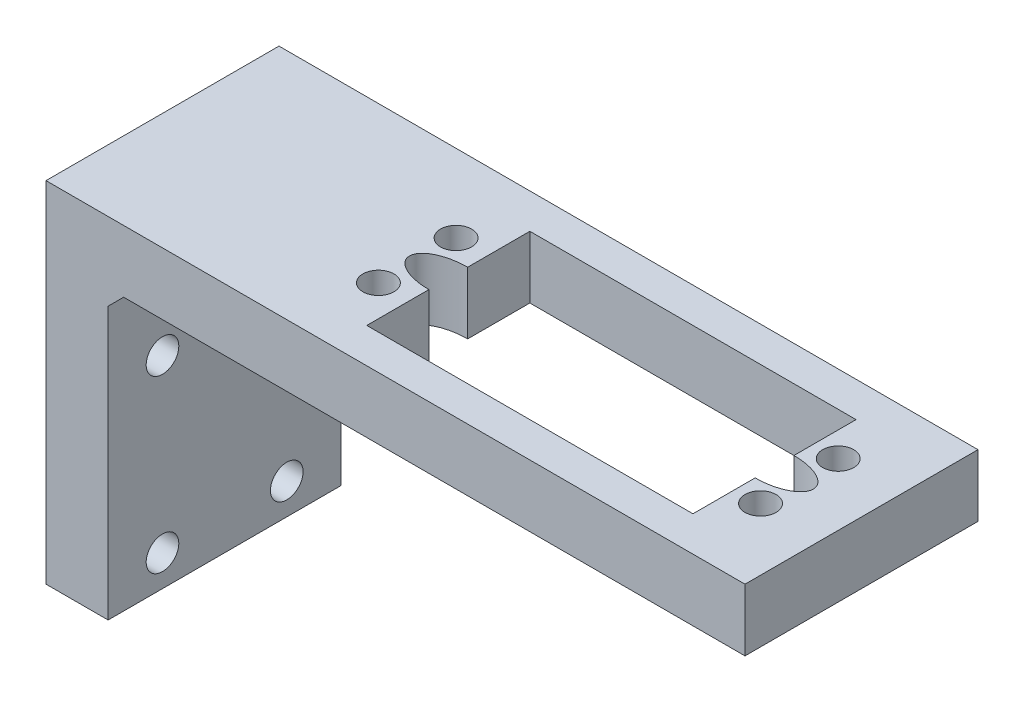
ISO-10303-21;
HEADER;
FILE_DESCRIPTION(('STEP AP214'),'2;1');
FILE_NAME('part.step','',(''),(''),'','','');
FILE_SCHEMA(('AUTOMOTIVE_DESIGN { 1 0 10303 214 1 1 1 1 }'));
ENDSEC;
DATA;
#1=APPLICATION_CONTEXT('core data for automotive mechanical design processes');
#2=APPLICATION_PROTOCOL_DEFINITION('international standard','automotive_design',2000,#1);
#3=PRODUCT_CONTEXT('',#1,'mechanical');
#4=PRODUCT('Part','Part','',(#3));
#5=PRODUCT_RELATED_PRODUCT_CATEGORY('part','',(#4));
#6=PRODUCT_DEFINITION_FORMATION('','',#4);
#7=PRODUCT_DEFINITION_CONTEXT('part definition',#1,'design');
#8=PRODUCT_DEFINITION('design','',#6,#7);
#9=PRODUCT_DEFINITION_SHAPE('','',#8);
#10=(LENGTH_UNIT() NAMED_UNIT(*) SI_UNIT(.MILLI.,.METRE.));
#11=(NAMED_UNIT(*) PLANE_ANGLE_UNIT() SI_UNIT($,.RADIAN.));
#12=(NAMED_UNIT(*) SI_UNIT($,.STERADIAN.) SOLID_ANGLE_UNIT());
#13=UNCERTAINTY_MEASURE_WITH_UNIT(LENGTH_MEASURE(1.E-05),#10,'distance_accuracy_value','');
#14=(GEOMETRIC_REPRESENTATION_CONTEXT(3) GLOBAL_UNCERTAINTY_ASSIGNED_CONTEXT((#13)) GLOBAL_UNIT_ASSIGNED_CONTEXT((#10,
#11,#12)) REPRESENTATION_CONTEXT('',''));
#15=CARTESIAN_POINT('',(0.,0.,0.));
#16=DIRECTION('',(0.,0.,1.));
#17=DIRECTION('',(1.,0.,0.));
#18=AXIS2_PLACEMENT_3D('',#15,#16,#17);
#19=CARTESIAN_POINT('',(0.,8.,0.));
#20=DIRECTION('',(0.,0.,-1.));
#21=DIRECTION('',(-1.,0.,0.));
#22=AXIS2_PLACEMENT_3D('',#19,#20,#21);
#23=PLANE('',#22);
#24=DIRECTION('',(0.707106781186548,0.707106781186548,0.));
#25=VECTOR('',#24,1.);
#26=CARTESIAN_POINT('',(0.,-2.,0.));
#27=LINE('',#26,#25);
#28=CARTESIAN_POINT('',(0.,-2.,0.));
#29=VERTEX_POINT('',#28);
#30=CARTESIAN_POINT('',(2.,0.,0.));
#31=VERTEX_POINT('',#30);
#32=EDGE_CURVE('E151',#29,#31,#27,.T.);
#33=ORIENTED_EDGE('',*,*,#32,.T.);
#34=DIRECTION('',(1.,0.,0.));
#35=VECTOR('',#34,1.);
#36=CARTESIAN_POINT('',(0.,0.,0.));
#37=LINE('',#36,#35);
#38=CARTESIAN_POINT('',(82.,0.,0.));
#39=VERTEX_POINT('',#38);
#40=EDGE_CURVE('E253',#31,#39,#37,.T.);
#41=ORIENTED_EDGE('',*,*,#40,.T.);
#42=DIRECTION('',(0.,-1.,0.));
#43=VECTOR('',#42,1.);
#44=CARTESIAN_POINT('',(82.,8.,0.));
#45=LINE('',#44,#43);
#46=CARTESIAN_POINT('',(82.,8.,0.));
#47=VERTEX_POINT('',#46);
#48=EDGE_CURVE('E11',#47,#39,#45,.T.);
#49=ORIENTED_EDGE('',*,*,#48,.F.);
#50=DIRECTION('',(1.,0.,0.));
#51=VECTOR('',#50,1.);
#52=CARTESIAN_POINT('',(0.,8.,0.));
#53=LINE('',#52,#51);
#54=CARTESIAN_POINT('',(-8.00000000000001,8.,0.));
#55=VERTEX_POINT('',#54);
#56=EDGE_CURVE('E258',#55,#47,#53,.T.);
#57=ORIENTED_EDGE('',*,*,#56,.F.);
#58=DIRECTION('',(0.,1.,0.));
#59=VECTOR('',#58,1.);
#60=CARTESIAN_POINT('',(-8.00000000000001,-37.,0.));
#61=LINE('',#60,#59);
#62=CARTESIAN_POINT('',(-8.00000000000001,-37.,0.));
#63=VERTEX_POINT('',#62);
#64=EDGE_CURVE('E177',#63,#55,#61,.T.);
#65=ORIENTED_EDGE('',*,*,#64,.F.);
#66=DIRECTION('',(1.,0.,0.));
#67=VECTOR('',#66,1.);
#68=CARTESIAN_POINT('',(0.,-37.,0.));
#69=LINE('',#68,#67);
#70=CARTESIAN_POINT('',(0.,-37.,0.));
#71=VERTEX_POINT('',#70);
#72=EDGE_CURVE('E286',#63,#71,#69,.T.);
#73=ORIENTED_EDGE('',*,*,#72,.T.);
#74=DIRECTION('',(0.,1.,0.));
#75=VECTOR('',#74,1.);
#76=CARTESIAN_POINT('',(0.,-37.,0.));
#77=LINE('',#76,#75);
#78=EDGE_CURVE('E172',#71,#29,#77,.T.);
#79=ORIENTED_EDGE('',*,*,#78,.T.);
#80=EDGE_LOOP('',(#33,#41,#49,#57,#65,#73,#79));
#81=FACE_BOUND('',#80,.T.);
#82=ADVANCED_FACE('F38',(#81),#23,.F.);
#83=CARTESIAN_POINT('',(82.,8.,0.));
#84=DIRECTION('',(-1.,0.,0.));
#85=DIRECTION('',(0.,0.,1.));
#86=AXIS2_PLACEMENT_3D('',#83,#84,#85);
#87=PLANE('',#86);
#88=DIRECTION('',(0.,0.,-1.));
#89=VECTOR('',#88,1.);
#90=CARTESIAN_POINT('',(82.,0.,0.));
#91=LINE('',#90,#89);
#92=CARTESIAN_POINT('',(82.,0.,-30.));
#93=VERTEX_POINT('',#92);
#94=EDGE_CURVE('E248',#39,#93,#91,.T.);
#95=ORIENTED_EDGE('',*,*,#94,.T.);
#96=DIRECTION('',(0.,-1.,0.));
#97=VECTOR('',#96,1.);
#98=CARTESIAN_POINT('',(82.,8.,-30.));
#99=LINE('',#98,#97);
#100=CARTESIAN_POINT('',(82.,8.,-30.));
#101=VERTEX_POINT('',#100);
#102=EDGE_CURVE('E46',#101,#93,#99,.T.);
#103=ORIENTED_EDGE('',*,*,#102,.F.);
#104=DIRECTION('',(0.,0.,-1.));
#105=VECTOR('',#104,1.);
#106=CARTESIAN_POINT('',(82.,8.,0.));
#107=LINE('',#106,#105);
#108=EDGE_CURVE('E260',#47,#101,#107,.T.);
#109=ORIENTED_EDGE('',*,*,#108,.F.);
#110=ORIENTED_EDGE('',*,*,#48,.T.);
#111=EDGE_LOOP('',(#95,#103,#109,#110));
#112=FACE_BOUND('',#111,.T.);
#113=ADVANCED_FACE('F239',(#112),#87,.F.);
#114=CARTESIAN_POINT('',(0.,8.,-30.));
#115=DIRECTION('',(0.,0.,1.));
#116=DIRECTION('',(1.,0.,0.));
#117=AXIS2_PLACEMENT_3D('',#114,#115,#116);
#118=PLANE('',#117);
#119=DIRECTION('',(-1.,0.,0.));
#120=VECTOR('',#119,1.);
#121=CARTESIAN_POINT('',(0.,0.,-30.));
#122=LINE('',#121,#120);
#123=CARTESIAN_POINT('',(2.,0.,-30.));
#124=VERTEX_POINT('',#123);
#125=EDGE_CURVE('E165',#93,#124,#122,.T.);
#126=ORIENTED_EDGE('',*,*,#125,.T.);
#127=DIRECTION('',(0.707106781186548,0.707106781186548,0.));
#128=VECTOR('',#127,1.);
#129=CARTESIAN_POINT('',(0.,-2.,-30.));
#130=LINE('',#129,#128);
#131=CARTESIAN_POINT('',(0.,-2.,-30.));
#132=VERTEX_POINT('',#131);
#133=EDGE_CURVE('E148',#132,#124,#130,.T.);
#134=ORIENTED_EDGE('',*,*,#133,.F.);
#135=DIRECTION('',(0.,1.,0.));
#136=VECTOR('',#135,1.);
#137=CARTESIAN_POINT('',(0.,-37.,-30.));
#138=LINE('',#137,#136);
#139=CARTESIAN_POINT('',(0.,-37.,-30.));
#140=VERTEX_POINT('',#139);
#141=EDGE_CURVE('E161',#140,#132,#138,.T.);
#142=ORIENTED_EDGE('',*,*,#141,.F.);
#143=DIRECTION('',(-1.,0.,0.));
#144=VECTOR('',#143,1.);
#145=CARTESIAN_POINT('',(-8.00000000000001,-37.,-30.));
#146=LINE('',#145,#144);
#147=CARTESIAN_POINT('',(-8.00000000000001,-37.,-30.));
#148=VERTEX_POINT('',#147);
#149=EDGE_CURVE('E281',#140,#148,#146,.T.);
#150=ORIENTED_EDGE('',*,*,#149,.T.);
#151=DIRECTION('',(0.,1.,0.));
#152=VECTOR('',#151,1.);
#153=CARTESIAN_POINT('',(-8.00000000000001,-37.,-30.));
#154=LINE('',#153,#152);
#155=CARTESIAN_POINT('',(-8.00000000000001,8.,-30.));
#156=VERTEX_POINT('',#155);
#157=EDGE_CURVE('E185',#148,#156,#154,.T.);
#158=ORIENTED_EDGE('',*,*,#157,.T.);
#159=DIRECTION('',(-1.,0.,0.));
#160=VECTOR('',#159,1.);
#161=CARTESIAN_POINT('',(0.,8.,-30.));
#162=LINE('',#161,#160);
#163=EDGE_CURVE('E255',#101,#156,#162,.T.);
#164=ORIENTED_EDGE('',*,*,#163,.F.);
#165=ORIENTED_EDGE('',*,*,#102,.T.);
#166=EDGE_LOOP('',(#126,#134,#142,#150,#158,#164,#165));
#167=FACE_BOUND('',#166,.T.);
#168=ADVANCED_FACE('F159',(#167),#118,.F.);
#169=CARTESIAN_POINT('',(0.,8.,0.));
#170=DIRECTION('',(0.,-1.,0.));
#171=DIRECTION('',(0.,0.,-1.));
#172=AXIS2_PLACEMENT_3D('',#169,#170,#171);
#173=PLANE('',#172);
#174=CARTESIAN_POINT('',(24.8,8.,-10.));
#175=DIRECTION('',(0.,1.,0.));
#176=DIRECTION('',(0.,0.,1.));
#177=AXIS2_PLACEMENT_3D('',#174,#175,#176);
#178=CIRCLE('',#177,2.);
#179=CARTESIAN_POINT('',(24.8,8.,-7.99999999999999));
#180=VERTEX_POINT('',#179);
#181=EDGE_CURVE('E171',#180,#180,#178,.T.);
#182=ORIENTED_EDGE('',*,*,#181,.F.);
#183=EDGE_LOOP('',(#182));
#184=FACE_BOUND('',#183,.T.);
#185=CARTESIAN_POINT('',(24.8,8.,-20.));
#186=DIRECTION('',(0.,1.,0.));
#187=DIRECTION('',(0.,0.,1.));
#188=AXIS2_PLACEMENT_3D('',#185,#186,#187);
#189=CIRCLE('',#188,2.);
#190=CARTESIAN_POINT('',(24.8,8.,-18.));
#191=VERTEX_POINT('',#190);
#192=EDGE_CURVE('E203',#191,#191,#189,.T.);
#193=ORIENTED_EDGE('',*,*,#192,.F.);
#194=EDGE_LOOP('',(#193));
#195=FACE_BOUND('',#194,.T.);
#196=CARTESIAN_POINT('',(74.,8.,-10.));
#197=DIRECTION('',(0.,1.,0.));
#198=DIRECTION('',(0.,0.,1.));
#199=AXIS2_PLACEMENT_3D('',#196,#197,#198);
#200=CIRCLE('',#199,2.);
#201=CARTESIAN_POINT('',(74.,8.,-8.));
#202=VERTEX_POINT('',#201);
#203=EDGE_CURVE('E197',#202,#202,#200,.T.);
#204=ORIENTED_EDGE('',*,*,#203,.F.);
#205=EDGE_LOOP('',(#204));
#206=FACE_BOUND('',#205,.T.);
#207=CARTESIAN_POINT('',(74.,8.,-20.));
#208=DIRECTION('',(0.,1.,0.));
#209=DIRECTION('',(0.,0.,1.));
#210=AXIS2_PLACEMENT_3D('',#207,#208,#209);
#211=CIRCLE('',#210,2.);
#212=CARTESIAN_POINT('',(74.,8.,-18.));
#213=VERTEX_POINT('',#212);
#214=EDGE_CURVE('E191',#213,#213,#211,.T.);
#215=ORIENTED_EDGE('',*,*,#214,.F.);
#216=EDGE_LOOP('',(#215));
#217=FACE_BOUND('',#216,.T.);
#218=CARTESIAN_POINT('',(28.8,8.,-15.));
#219=DIRECTION('',(0.,1.,0.));
#220=DIRECTION('',(1.,0.,0.));
#221=AXIS2_PLACEMENT_3D('',#218,#219,#220);
#222=ELLIPSE('',#221,5.,2.5);
#223=CARTESIAN_POINT('',(28.8,8.,-17.5));
#224=VERTEX_POINT('',#223);
#225=CARTESIAN_POINT('',(28.8,8.,-12.5));
#226=VERTEX_POINT('',#225);
#227=EDGE_CURVE('E334',#224,#226,#222,.T.);
#228=ORIENTED_EDGE('',*,*,#227,.F.);
#229=DIRECTION('',(0.,0.,1.));
#230=VECTOR('',#229,1.);
#231=CARTESIAN_POINT('',(28.8,8.,-25.5));
#232=LINE('',#231,#230);
#233=CARTESIAN_POINT('',(28.8,8.,-25.5));
#234=VERTEX_POINT('',#233);
#235=EDGE_CURVE('E54',#234,#224,#232,.T.);
#236=ORIENTED_EDGE('',*,*,#235,.F.);
#237=DIRECTION('',(-1.,0.,0.));
#238=VECTOR('',#237,1.);
#239=CARTESIAN_POINT('',(28.8,8.,-25.5));
#240=LINE('',#239,#238);
#241=CARTESIAN_POINT('',(70.8,8.,-25.5));
#242=VERTEX_POINT('',#241);
#243=EDGE_CURVE('E212',#242,#234,#240,.T.);
#244=ORIENTED_EDGE('',*,*,#243,.F.);
#245=DIRECTION('',(0.,0.,-1.));
#246=VECTOR('',#245,1.);
#247=CARTESIAN_POINT('',(70.8,8.,-25.5));
#248=LINE('',#247,#246);
#249=CARTESIAN_POINT('',(70.8,8.,-17.5));
#250=VERTEX_POINT('',#249);
#251=EDGE_CURVE('E347',#250,#242,#248,.T.);
#252=ORIENTED_EDGE('',*,*,#251,.F.);
#253=CARTESIAN_POINT('',(70.8,8.,-15.));
#254=DIRECTION('',(0.,1.,0.));
#255=DIRECTION('',(-1.,0.,0.));
#256=AXIS2_PLACEMENT_3D('',#253,#254,#255);
#257=ELLIPSE('',#256,4.99999999999999,2.5);
#258=CARTESIAN_POINT('',(70.8,8.,-12.5));
#259=VERTEX_POINT('',#258);
#260=EDGE_CURVE('E345',#259,#250,#257,.T.);
#261=ORIENTED_EDGE('',*,*,#260,.F.);
#262=DIRECTION('',(0.,0.,-1.));
#263=VECTOR('',#262,1.);
#264=CARTESIAN_POINT('',(70.8,8.,-12.5));
#265=LINE('',#264,#263);
#266=CARTESIAN_POINT('',(70.8,8.,-4.5));
#267=VERTEX_POINT('',#266);
#268=EDGE_CURVE('E342',#267,#259,#265,.T.);
#269=ORIENTED_EDGE('',*,*,#268,.F.);
#270=DIRECTION('',(1.,0.,0.));
#271=VECTOR('',#270,1.);
#272=CARTESIAN_POINT('',(28.8,8.,-4.5));
#273=LINE('',#272,#271);
#274=CARTESIAN_POINT('',(28.8,8.,-4.5));
#275=VERTEX_POINT('',#274);
#276=EDGE_CURVE('E339',#275,#267,#273,.T.);
#277=ORIENTED_EDGE('',*,*,#276,.F.);
#278=DIRECTION('',(0.,0.,1.));
#279=VECTOR('',#278,1.);
#280=CARTESIAN_POINT('',(28.8,8.,-12.5));
#281=LINE('',#280,#279);
#282=EDGE_CURVE('E336',#226,#275,#281,.T.);
#283=ORIENTED_EDGE('',*,*,#282,.F.);
#284=EDGE_LOOP('',(#228,#236,#244,#252,#261,#269,#277,#283));
#285=FACE_BOUND('',#284,.T.);
#286=ORIENTED_EDGE('',*,*,#163,.T.);
#287=DIRECTION('',(0.,0.,1.));
#288=VECTOR('',#287,1.);
#289=CARTESIAN_POINT('',(-8.00000000000001,8.,0.));
#290=LINE('',#289,#288);
#291=EDGE_CURVE('E180',#156,#55,#290,.T.);
#292=ORIENTED_EDGE('',*,*,#291,.T.);
#293=ORIENTED_EDGE('',*,*,#56,.T.);
#294=ORIENTED_EDGE('',*,*,#108,.T.);
#295=EDGE_LOOP('',(#286,#292,#293,#294));
#296=FACE_BOUND('',#295,.T.);
#297=ADVANCED_FACE('F231',(#184,#195,#206,#217,#285,#296),#173,.F.);
#298=CARTESIAN_POINT('',(0.,0.,0.));
#299=DIRECTION('',(0.,-1.,0.));
#300=DIRECTION('',(0.,0.,-1.));
#301=AXIS2_PLACEMENT_3D('',#298,#299,#300);
#302=PLANE('',#301);
#303=DIRECTION('',(0.,0.,1.));
#304=VECTOR('',#303,1.);
#305=CARTESIAN_POINT('',(2.,0.,-30.));
#306=LINE('',#305,#304);
#307=EDGE_CURVE('E155',#124,#31,#306,.T.);
#308=ORIENTED_EDGE('',*,*,#307,.F.);
#309=ORIENTED_EDGE('',*,*,#125,.F.);
#310=ORIENTED_EDGE('',*,*,#94,.F.);
#311=ORIENTED_EDGE('',*,*,#40,.F.);
#312=EDGE_LOOP('',(#308,#309,#310,#311));
#313=FACE_BOUND('',#312,.T.);
#314=CARTESIAN_POINT('',(24.8,0.,-10.));
#315=DIRECTION('',(0.,1.,0.));
#316=DIRECTION('',(0.,0.,1.));
#317=AXIS2_PLACEMENT_3D('',#314,#315,#316);
#318=CIRCLE('',#317,2.);
#319=CARTESIAN_POINT('',(24.8,0.,-7.99999999999999));
#320=VERTEX_POINT('',#319);
#321=EDGE_CURVE('E175',#320,#320,#318,.T.);
#322=ORIENTED_EDGE('',*,*,#321,.T.);
#323=EDGE_LOOP('',(#322));
#324=FACE_BOUND('',#323,.T.);
#325=CARTESIAN_POINT('',(24.8,0.,-20.));
#326=DIRECTION('',(0.,1.,0.));
#327=DIRECTION('',(0.,0.,1.));
#328=AXIS2_PLACEMENT_3D('',#325,#326,#327);
#329=CIRCLE('',#328,2.);
#330=CARTESIAN_POINT('',(24.8,0.,-18.));
#331=VERTEX_POINT('',#330);
#332=EDGE_CURVE('E200',#331,#331,#329,.T.);
#333=ORIENTED_EDGE('',*,*,#332,.T.);
#334=EDGE_LOOP('',(#333));
#335=FACE_BOUND('',#334,.T.);
#336=CARTESIAN_POINT('',(74.,0.,-10.));
#337=DIRECTION('',(0.,1.,0.));
#338=DIRECTION('',(0.,0.,1.));
#339=AXIS2_PLACEMENT_3D('',#336,#337,#338);
#340=CIRCLE('',#339,2.);
#341=CARTESIAN_POINT('',(74.,0.,-8.));
#342=VERTEX_POINT('',#341);
#343=EDGE_CURVE('E194',#342,#342,#340,.T.);
#344=ORIENTED_EDGE('',*,*,#343,.T.);
#345=EDGE_LOOP('',(#344));
#346=FACE_BOUND('',#345,.T.);
#347=CARTESIAN_POINT('',(74.,0.,-20.));
#348=DIRECTION('',(0.,1.,0.));
#349=DIRECTION('',(0.,0.,1.));
#350=AXIS2_PLACEMENT_3D('',#347,#348,#349);
#351=CIRCLE('',#350,2.);
#352=CARTESIAN_POINT('',(74.,0.,-18.));
#353=VERTEX_POINT('',#352);
#354=EDGE_CURVE('E188',#353,#353,#351,.T.);
#355=ORIENTED_EDGE('',*,*,#354,.T.);
#356=EDGE_LOOP('',(#355));
#357=FACE_BOUND('',#356,.T.);
#358=DIRECTION('',(0.,0.,1.));
#359=VECTOR('',#358,1.);
#360=CARTESIAN_POINT('',(28.8,0.,-25.5));
#361=LINE('',#360,#359);
#362=CARTESIAN_POINT('',(28.8,0.,-25.5));
#363=VERTEX_POINT('',#362);
#364=CARTESIAN_POINT('',(28.8,0.,-17.5));
#365=VERTEX_POINT('',#364);
#366=EDGE_CURVE('E208',#363,#365,#361,.T.);
#367=ORIENTED_EDGE('',*,*,#366,.T.);
#368=CARTESIAN_POINT('',(28.8,0.,-15.));
#369=DIRECTION('',(0.,1.,0.));
#370=DIRECTION('',(1.,0.,0.));
#371=AXIS2_PLACEMENT_3D('',#368,#369,#370);
#372=ELLIPSE('',#371,5.,2.5);
#373=CARTESIAN_POINT('',(28.8,0.,-12.5));
#374=VERTEX_POINT('',#373);
#375=EDGE_CURVE('E211',#365,#374,#372,.T.);
#376=ORIENTED_EDGE('',*,*,#375,.T.);
#377=DIRECTION('',(0.,0.,1.));
#378=VECTOR('',#377,1.);
#379=CARTESIAN_POINT('',(28.8,0.,-12.5));
#380=LINE('',#379,#378);
#381=CARTESIAN_POINT('',(28.8,0.,-4.5));
#382=VERTEX_POINT('',#381);
#383=EDGE_CURVE('E62',#374,#382,#380,.T.);
#384=ORIENTED_EDGE('',*,*,#383,.T.);
#385=DIRECTION('',(1.,0.,0.));
#386=VECTOR('',#385,1.);
#387=CARTESIAN_POINT('',(28.8,0.,-4.5));
#388=LINE('',#387,#386);
#389=CARTESIAN_POINT('',(70.8,0.,-4.5));
#390=VERTEX_POINT('',#389);
#391=EDGE_CURVE('E359',#382,#390,#388,.T.);
#392=ORIENTED_EDGE('',*,*,#391,.T.);
#393=DIRECTION('',(0.,0.,-1.));
#394=VECTOR('',#393,1.);
#395=CARTESIAN_POINT('',(70.8,0.,-12.5));
#396=LINE('',#395,#394);
#397=CARTESIAN_POINT('',(70.8,0.,-12.5));
#398=VERTEX_POINT('',#397);
#399=EDGE_CURVE('E360',#390,#398,#396,.T.);
#400=ORIENTED_EDGE('',*,*,#399,.T.);
#401=CARTESIAN_POINT('',(70.8,0.,-15.));
#402=DIRECTION('',(0.,1.,0.));
#403=DIRECTION('',(-1.,0.,0.));
#404=AXIS2_PLACEMENT_3D('',#401,#402,#403);
#405=ELLIPSE('',#404,4.99999999999999,2.5);
#406=CARTESIAN_POINT('',(70.8,0.,-17.5));
#407=VERTEX_POINT('',#406);
#408=EDGE_CURVE('E329',#398,#407,#405,.T.);
#409=ORIENTED_EDGE('',*,*,#408,.T.);
#410=DIRECTION('',(0.,0.,-1.));
#411=VECTOR('',#410,1.);
#412=CARTESIAN_POINT('',(70.8,0.,-25.5));
#413=LINE('',#412,#411);
#414=CARTESIAN_POINT('',(70.8,0.,-25.5));
#415=VERTEX_POINT('',#414);
#416=EDGE_CURVE('E324',#407,#415,#413,.T.);
#417=ORIENTED_EDGE('',*,*,#416,.T.);
#418=DIRECTION('',(-1.,0.,0.));
#419=VECTOR('',#418,1.);
#420=CARTESIAN_POINT('',(28.8,0.,-25.5));
#421=LINE('',#420,#419);
#422=EDGE_CURVE('E319',#415,#363,#421,.T.);
#423=ORIENTED_EDGE('',*,*,#422,.T.);
#424=EDGE_LOOP('',(#367,#376,#384,#392,#400,#409,#417,#423));
#425=FACE_BOUND('',#424,.T.);
#426=ADVANCED_FACE('F230',(#313,#324,#335,#346,#357,#425),#302,.T.);
#427=CARTESIAN_POINT('',(28.8,0.,-25.5));
#428=DIRECTION('',(-1.,0.,0.));
#429=DIRECTION('',(0.,0.,1.));
#430=AXIS2_PLACEMENT_3D('',#427,#428,#429);
#431=PLANE('',#430);
#432=ORIENTED_EDGE('',*,*,#235,.T.);
#433=DIRECTION('',(0.,1.,0.));
#434=VECTOR('',#433,1.);
#435=CARTESIAN_POINT('',(28.8,0.,-17.5));
#436=LINE('',#435,#434);
#437=EDGE_CURVE('E318',#365,#224,#436,.T.);
#438=ORIENTED_EDGE('',*,*,#437,.F.);
#439=ORIENTED_EDGE('',*,*,#366,.F.);
#440=DIRECTION('',(0.,1.,0.));
#441=VECTOR('',#440,1.);
#442=CARTESIAN_POINT('',(28.8,0.,-25.5));
#443=LINE('',#442,#441);
#444=EDGE_CURVE('E299',#363,#234,#443,.T.);
#445=ORIENTED_EDGE('',*,*,#444,.T.);
#446=EDGE_LOOP('',(#432,#438,#439,#445));
#447=FACE_BOUND('',#446,.T.);
#448=ADVANCED_FACE('F226',(#447),#431,.F.);
#449=CARTESIAN_POINT('',(28.8,0.,-25.5));
#450=DIRECTION('',(0.,0.,-1.));
#451=DIRECTION('',(-1.,0.,0.));
#452=AXIS2_PLACEMENT_3D('',#449,#450,#451);
#453=PLANE('',#452);
#454=ORIENTED_EDGE('',*,*,#243,.T.);
#455=ORIENTED_EDGE('',*,*,#444,.F.);
#456=ORIENTED_EDGE('',*,*,#422,.F.);
#457=DIRECTION('',(0.,1.,0.));
#458=VECTOR('',#457,1.);
#459=CARTESIAN_POINT('',(70.8,0.,-25.5));
#460=LINE('',#459,#458);
#461=EDGE_CURVE('E300',#415,#242,#460,.T.);
#462=ORIENTED_EDGE('',*,*,#461,.T.);
#463=EDGE_LOOP('',(#454,#455,#456,#462));
#464=FACE_BOUND('',#463,.T.);
#465=ADVANCED_FACE('F229',(#464),#453,.F.);
#466=CARTESIAN_POINT('',(70.8,0.,-25.5));
#467=DIRECTION('',(1.,0.,0.));
#468=DIRECTION('',(0.,0.,-1.));
#469=AXIS2_PLACEMENT_3D('',#466,#467,#468);
#470=PLANE('',#469);
#471=ORIENTED_EDGE('',*,*,#251,.T.);
#472=ORIENTED_EDGE('',*,*,#461,.F.);
#473=ORIENTED_EDGE('',*,*,#416,.F.);
#474=DIRECTION('',(0.,1.,0.));
#475=VECTOR('',#474,1.);
#476=CARTESIAN_POINT('',(70.8,0.,-17.5));
#477=LINE('',#476,#475);
#478=EDGE_CURVE('E304',#407,#250,#477,.T.);
#479=ORIENTED_EDGE('',*,*,#478,.T.);
#480=EDGE_LOOP('',(#471,#472,#473,#479));
#481=FACE_BOUND('',#480,.T.);
#482=ADVANCED_FACE('F370',(#481),#470,.F.);
#483=DIRECTION('',(0.,1.,0.));
#484=VECTOR('',#483,1.);
#485=SURFACE_OF_LINEAR_EXTRUSION('',#405,#484);
#486=ORIENTED_EDGE('',*,*,#260,.T.);
#487=ORIENTED_EDGE('',*,*,#478,.F.);
#488=ORIENTED_EDGE('',*,*,#408,.F.);
#489=DIRECTION('',(0.,1.,0.));
#490=VECTOR('',#489,1.);
#491=CARTESIAN_POINT('',(70.8,0.,-12.5));
#492=LINE('',#491,#490);
#493=EDGE_CURVE('E310',#398,#259,#492,.T.);
#494=ORIENTED_EDGE('',*,*,#493,.T.);
#495=EDGE_LOOP('',(#486,#487,#488,#494));
#496=FACE_BOUND('',#495,.T.);
#497=ADVANCED_FACE('F365',(#496),#485,.F.);
#498=CARTESIAN_POINT('',(70.8,0.,-12.5));
#499=DIRECTION('',(1.,0.,0.));
#500=DIRECTION('',(0.,0.,-1.));
#501=AXIS2_PLACEMENT_3D('',#498,#499,#500);
#502=PLANE('',#501);
#503=ORIENTED_EDGE('',*,*,#268,.T.);
#504=ORIENTED_EDGE('',*,*,#493,.F.);
#505=ORIENTED_EDGE('',*,*,#399,.F.);
#506=DIRECTION('',(0.,1.,0.));
#507=VECTOR('',#506,1.);
#508=CARTESIAN_POINT('',(70.8,0.,-4.5));
#509=LINE('',#508,#507);
#510=EDGE_CURVE('E312',#390,#267,#509,.T.);
#511=ORIENTED_EDGE('',*,*,#510,.T.);
#512=EDGE_LOOP('',(#503,#504,#505,#511));
#513=FACE_BOUND('',#512,.T.);
#514=ADVANCED_FACE('F369',(#513),#502,.F.);
#515=CARTESIAN_POINT('',(28.8,0.,-4.5));
#516=DIRECTION('',(0.,0.,1.));
#517=DIRECTION('',(1.,0.,0.));
#518=AXIS2_PLACEMENT_3D('',#515,#516,#517);
#519=PLANE('',#518);
#520=ORIENTED_EDGE('',*,*,#276,.T.);
#521=ORIENTED_EDGE('',*,*,#510,.F.);
#522=ORIENTED_EDGE('',*,*,#391,.F.);
#523=DIRECTION('',(0.,1.,0.));
#524=VECTOR('',#523,1.);
#525=CARTESIAN_POINT('',(28.8,0.,-4.5));
#526=LINE('',#525,#524);
#527=EDGE_CURVE('E314',#382,#275,#526,.T.);
#528=ORIENTED_EDGE('',*,*,#527,.T.);
#529=EDGE_LOOP('',(#520,#521,#522,#528));
#530=FACE_BOUND('',#529,.T.);
#531=ADVANCED_FACE('F374',(#530),#519,.F.);
#532=CARTESIAN_POINT('',(28.8,0.,-12.5));
#533=DIRECTION('',(-1.,0.,0.));
#534=DIRECTION('',(0.,0.,1.));
#535=AXIS2_PLACEMENT_3D('',#532,#533,#534);
#536=PLANE('',#535);
#537=ORIENTED_EDGE('',*,*,#282,.T.);
#538=ORIENTED_EDGE('',*,*,#527,.F.);
#539=ORIENTED_EDGE('',*,*,#383,.F.);
#540=DIRECTION('',(0.,1.,0.));
#541=VECTOR('',#540,1.);
#542=CARTESIAN_POINT('',(28.8,0.,-12.5));
#543=LINE('',#542,#541);
#544=EDGE_CURVE('E316',#374,#226,#543,.T.);
#545=ORIENTED_EDGE('',*,*,#544,.T.);
#546=EDGE_LOOP('',(#537,#538,#539,#545));
#547=FACE_BOUND('',#546,.T.);
#548=ADVANCED_FACE('F223',(#547),#536,.F.);
#549=DIRECTION('',(0.,1.,0.));
#550=VECTOR('',#549,1.);
#551=SURFACE_OF_LINEAR_EXTRUSION('',#372,#550);
#552=ORIENTED_EDGE('',*,*,#227,.T.);
#553=ORIENTED_EDGE('',*,*,#544,.F.);
#554=ORIENTED_EDGE('',*,*,#375,.F.);
#555=ORIENTED_EDGE('',*,*,#437,.T.);
#556=EDGE_LOOP('',(#552,#553,#554,#555));
#557=FACE_BOUND('',#556,.T.);
#558=ADVANCED_FACE('F218',(#557),#551,.F.);
#559=CARTESIAN_POINT('',(74.,0.,-20.));
#560=DIRECTION('',(0.,1.,0.));
#561=DIRECTION('',(0.,0.,1.));
#562=AXIS2_PLACEMENT_3D('',#559,#560,#561);
#563=CYLINDRICAL_SURFACE('',#562,2.);
#564=ORIENTED_EDGE('',*,*,#354,.F.);
#565=EDGE_LOOP('',(#564));
#566=FACE_BOUND('',#565,.T.);
#567=ORIENTED_EDGE('',*,*,#214,.T.);
#568=EDGE_LOOP('',(#567));
#569=FACE_BOUND('',#568,.T.);
#570=ADVANCED_FACE('F222',(#566,#569),#563,.F.);
#571=CARTESIAN_POINT('',(74.,0.,-10.));
#572=DIRECTION('',(0.,1.,0.));
#573=DIRECTION('',(0.,0.,1.));
#574=AXIS2_PLACEMENT_3D('',#571,#572,#573);
#575=CYLINDRICAL_SURFACE('',#574,2.);
#576=ORIENTED_EDGE('',*,*,#343,.F.);
#577=EDGE_LOOP('',(#576));
#578=FACE_BOUND('',#577,.T.);
#579=ORIENTED_EDGE('',*,*,#203,.T.);
#580=EDGE_LOOP('',(#579));
#581=FACE_BOUND('',#580,.T.);
#582=ADVANCED_FACE('F400',(#578,#581),#575,.F.);
#583=CARTESIAN_POINT('',(24.8,0.,-20.));
#584=DIRECTION('',(0.,1.,0.));
#585=DIRECTION('',(0.,0.,1.));
#586=AXIS2_PLACEMENT_3D('',#583,#584,#585);
#587=CYLINDRICAL_SURFACE('',#586,2.);
#588=ORIENTED_EDGE('',*,*,#332,.F.);
#589=EDGE_LOOP('',(#588));
#590=FACE_BOUND('',#589,.T.);
#591=ORIENTED_EDGE('',*,*,#192,.T.);
#592=EDGE_LOOP('',(#591));
#593=FACE_BOUND('',#592,.T.);
#594=ADVANCED_FACE('F396',(#590,#593),#587,.F.);
#595=CARTESIAN_POINT('',(24.8,0.,-10.));
#596=DIRECTION('',(0.,1.,0.));
#597=DIRECTION('',(0.,0.,1.));
#598=AXIS2_PLACEMENT_3D('',#595,#596,#597);
#599=CYLINDRICAL_SURFACE('',#598,2.);
#600=ORIENTED_EDGE('',*,*,#321,.F.);
#601=EDGE_LOOP('',(#600));
#602=FACE_BOUND('',#601,.T.);
#603=ORIENTED_EDGE('',*,*,#181,.T.);
#604=EDGE_LOOP('',(#603));
#605=FACE_BOUND('',#604,.T.);
#606=ADVANCED_FACE('F393',(#602,#605),#599,.F.);
#607=CARTESIAN_POINT('',(0.,-37.,-30.));
#608=DIRECTION('',(1.,0.,0.));
#609=DIRECTION('',(0.,0.,-1.));
#610=AXIS2_PLACEMENT_3D('',#607,#608,#609);
#611=PLANE('',#610);
#612=CARTESIAN_POINT('',(0.,-11.,-7.));
#613=DIRECTION('',(1.,0.,0.));
#614=DIRECTION('',(0.,0.,-1.));
#615=AXIS2_PLACEMENT_3D('',#612,#613,#614);
#616=CIRCLE('',#615,2.1);
#617=CARTESIAN_POINT('',(0.,-11.,-9.1));
#618=VERTEX_POINT('',#617);
#619=EDGE_CURVE('E442',#618,#618,#616,.T.);
#620=ORIENTED_EDGE('',*,*,#619,.F.);
#621=EDGE_LOOP('',(#620));
#622=FACE_BOUND('',#621,.T.);
#623=CARTESIAN_POINT('',(0.,-33.,-23.));
#624=DIRECTION('',(1.,0.,0.));
#625=DIRECTION('',(0.,0.,-1.));
#626=AXIS2_PLACEMENT_3D('',#623,#624,#625);
#627=CIRCLE('',#626,2.1);
#628=CARTESIAN_POINT('',(0.,-33.,-25.1));
#629=VERTEX_POINT('',#628);
#630=EDGE_CURVE('E439',#629,#629,#627,.T.);
#631=ORIENTED_EDGE('',*,*,#630,.F.);
#632=EDGE_LOOP('',(#631));
#633=FACE_BOUND('',#632,.T.);
#634=CARTESIAN_POINT('',(0.,-11.,-23.));
#635=DIRECTION('',(1.,0.,0.));
#636=DIRECTION('',(0.,0.,-1.));
#637=AXIS2_PLACEMENT_3D('',#634,#635,#636);
#638=CIRCLE('',#637,2.1);
#639=CARTESIAN_POINT('',(0.,-11.,-25.1));
#640=VERTEX_POINT('',#639);
#641=EDGE_CURVE('E437',#640,#640,#638,.T.);
#642=ORIENTED_EDGE('',*,*,#641,.F.);
#643=EDGE_LOOP('',(#642));
#644=FACE_BOUND('',#643,.T.);
#645=CARTESIAN_POINT('',(0.,-33.,-7.));
#646=DIRECTION('',(1.,0.,0.));
#647=DIRECTION('',(0.,0.,-1.));
#648=AXIS2_PLACEMENT_3D('',#645,#646,#647);
#649=CIRCLE('',#648,2.1);
#650=CARTESIAN_POINT('',(0.,-33.,-9.1));
#651=VERTEX_POINT('',#650);
#652=EDGE_CURVE('E268',#651,#651,#649,.T.);
#653=ORIENTED_EDGE('',*,*,#652,.F.);
#654=EDGE_LOOP('',(#653));
#655=FACE_BOUND('',#654,.T.);
#656=DIRECTION('',(0.,0.,1.));
#657=VECTOR('',#656,1.);
#658=CARTESIAN_POINT('',(0.,-2.,-30.));
#659=LINE('',#658,#657);
#660=EDGE_CURVE('E145',#132,#29,#659,.T.);
#661=ORIENTED_EDGE('',*,*,#660,.T.);
#662=ORIENTED_EDGE('',*,*,#78,.F.);
#663=DIRECTION('',(0.,0.,-1.));
#664=VECTOR('',#663,1.);
#665=CARTESIAN_POINT('',(0.,-37.,-30.));
#666=LINE('',#665,#664);
#667=EDGE_CURVE('E170',#71,#140,#666,.T.);
#668=ORIENTED_EDGE('',*,*,#667,.T.);
#669=ORIENTED_EDGE('',*,*,#141,.T.);
#670=EDGE_LOOP('',(#661,#662,#668,#669));
#671=FACE_BOUND('',#670,.T.);
#672=ADVANCED_FACE('F168',(#622,#633,#644,#655,#671),#611,.T.);
#673=CARTESIAN_POINT('',(-8.00000000000001,-37.,0.));
#674=DIRECTION('',(-1.,0.,0.));
#675=DIRECTION('',(0.,0.,1.));
#676=AXIS2_PLACEMENT_3D('',#673,#674,#675);
#677=PLANE('',#676);
#678=CARTESIAN_POINT('',(-8.00000000000001,-11.,-7.));
#679=DIRECTION('',(-1.,0.,0.));
#680=DIRECTION('',(0.,0.,1.));
#681=AXIS2_PLACEMENT_3D('',#678,#679,#680);
#682=CIRCLE('',#681,2.1);
#683=CARTESIAN_POINT('',(-8.00000000000001,-11.,-4.9));
#684=VERTEX_POINT('',#683);
#685=EDGE_CURVE('E41',#684,#684,#682,.T.);
#686=ORIENTED_EDGE('',*,*,#685,.F.);
#687=EDGE_LOOP('',(#686));
#688=FACE_BOUND('',#687,.T.);
#689=CARTESIAN_POINT('',(-8.00000000000001,-33.,-23.));
#690=DIRECTION('',(-1.,0.,0.));
#691=DIRECTION('',(0.,0.,1.));
#692=AXIS2_PLACEMENT_3D('',#689,#690,#691);
#693=CIRCLE('',#692,2.1);
#694=CARTESIAN_POINT('',(-8.00000000000001,-33.,-20.9));
#695=VERTEX_POINT('',#694);
#696=EDGE_CURVE('E270',#695,#695,#693,.T.);
#697=ORIENTED_EDGE('',*,*,#696,.F.);
#698=EDGE_LOOP('',(#697));
#699=FACE_BOUND('',#698,.T.);
#700=CARTESIAN_POINT('',(-8.00000000000001,-11.,-23.));
#701=DIRECTION('',(-1.,0.,0.));
#702=DIRECTION('',(0.,0.,1.));
#703=AXIS2_PLACEMENT_3D('',#700,#701,#702);
#704=CIRCLE('',#703,2.1);
#705=CARTESIAN_POINT('',(-8.00000000000001,-11.,-20.9));
#706=VERTEX_POINT('',#705);
#707=EDGE_CURVE('E267',#706,#706,#704,.T.);
#708=ORIENTED_EDGE('',*,*,#707,.F.);
#709=EDGE_LOOP('',(#708));
#710=FACE_BOUND('',#709,.T.);
#711=CARTESIAN_POINT('',(-8.00000000000001,-33.,-7.));
#712=DIRECTION('',(-1.,0.,0.));
#713=DIRECTION('',(0.,0.,1.));
#714=AXIS2_PLACEMENT_3D('',#711,#712,#713);
#715=CIRCLE('',#714,2.1);
#716=CARTESIAN_POINT('',(-8.00000000000001,-33.,-4.9));
#717=VERTEX_POINT('',#716);
#718=EDGE_CURVE('E264',#717,#717,#715,.T.);
#719=ORIENTED_EDGE('',*,*,#718,.F.);
#720=EDGE_LOOP('',(#719));
#721=FACE_BOUND('',#720,.T.);
#722=ORIENTED_EDGE('',*,*,#291,.F.);
#723=ORIENTED_EDGE('',*,*,#157,.F.);
#724=DIRECTION('',(0.,0.,1.));
#725=VECTOR('',#724,1.);
#726=CARTESIAN_POINT('',(-8.00000000000001,-37.,0.));
#727=LINE('',#726,#725);
#728=EDGE_CURVE('E283',#148,#63,#727,.T.);
#729=ORIENTED_EDGE('',*,*,#728,.T.);
#730=ORIENTED_EDGE('',*,*,#64,.T.);
#731=EDGE_LOOP('',(#722,#723,#729,#730));
#732=FACE_BOUND('',#731,.T.);
#733=ADVANCED_FACE('F295',(#688,#699,#710,#721,#732),#677,.T.);
#734=CARTESIAN_POINT('',(0.,-37.,0.));
#735=DIRECTION('',(0.,-1.,0.));
#736=DIRECTION('',(0.,0.,-1.));
#737=AXIS2_PLACEMENT_3D('',#734,#735,#736);
#738=PLANE('',#737);
#739=ORIENTED_EDGE('',*,*,#149,.F.);
#740=ORIENTED_EDGE('',*,*,#667,.F.);
#741=ORIENTED_EDGE('',*,*,#72,.F.);
#742=ORIENTED_EDGE('',*,*,#728,.F.);
#743=EDGE_LOOP('',(#739,#740,#741,#742));
#744=FACE_BOUND('',#743,.T.);
#745=ADVANCED_FACE('F291',(#744),#738,.T.);
#746=CARTESIAN_POINT('',(0.,-2.,-30.));
#747=DIRECTION('',(0.707106781186548,-0.707106781186547,0.));
#748=DIRECTION('',(0.707106781186547,0.707106781186548,0.));
#749=AXIS2_PLACEMENT_3D('',#746,#747,#748);
#750=PLANE('',#749);
#751=ORIENTED_EDGE('',*,*,#32,.F.);
#752=ORIENTED_EDGE('',*,*,#660,.F.);
#753=ORIENTED_EDGE('',*,*,#133,.T.);
#754=ORIENTED_EDGE('',*,*,#307,.T.);
#755=EDGE_LOOP('',(#751,#752,#753,#754));
#756=FACE_BOUND('',#755,.T.);
#757=ADVANCED_FACE('F147',(#756),#750,.T.);
#758=CARTESIAN_POINT('',(-10.,-33.,-7.));
#759=DIRECTION('',(1.,0.,0.));
#760=DIRECTION('',(0.,0.,-1.));
#761=AXIS2_PLACEMENT_3D('',#758,#759,#760);
#762=CYLINDRICAL_SURFACE('',#761,2.1);
#763=ORIENTED_EDGE('',*,*,#718,.T.);
#764=EDGE_LOOP('',(#763));
#765=FACE_BOUND('',#764,.T.);
#766=ORIENTED_EDGE('',*,*,#652,.T.);
#767=EDGE_LOOP('',(#766));
#768=FACE_BOUND('',#767,.T.);
#769=ADVANCED_FACE('F418',(#765,#768),#762,.F.);
#770=CARTESIAN_POINT('',(-10.,-11.,-23.));
#771=DIRECTION('',(1.,0.,0.));
#772=DIRECTION('',(0.,0.,-1.));
#773=AXIS2_PLACEMENT_3D('',#770,#771,#772);
#774=CYLINDRICAL_SURFACE('',#773,2.1);
#775=ORIENTED_EDGE('',*,*,#707,.T.);
#776=EDGE_LOOP('',(#775));
#777=FACE_BOUND('',#776,.T.);
#778=ORIENTED_EDGE('',*,*,#641,.T.);
#779=EDGE_LOOP('',(#778));
#780=FACE_BOUND('',#779,.T.);
#781=ADVANCED_FACE('F421',(#777,#780),#774,.F.);
#782=CARTESIAN_POINT('',(-10.,-33.,-23.));
#783=DIRECTION('',(1.,0.,0.));
#784=DIRECTION('',(0.,0.,-1.));
#785=AXIS2_PLACEMENT_3D('',#782,#783,#784);
#786=CYLINDRICAL_SURFACE('',#785,2.1);
#787=ORIENTED_EDGE('',*,*,#696,.T.);
#788=EDGE_LOOP('',(#787));
#789=FACE_BOUND('',#788,.T.);
#790=ORIENTED_EDGE('',*,*,#630,.T.);
#791=EDGE_LOOP('',(#790));
#792=FACE_BOUND('',#791,.T.);
#793=ADVANCED_FACE('F423',(#789,#792),#786,.F.);
#794=CARTESIAN_POINT('',(-10.,-11.,-7.));
#795=DIRECTION('',(1.,0.,0.));
#796=DIRECTION('',(0.,0.,-1.));
#797=AXIS2_PLACEMENT_3D('',#794,#795,#796);
#798=CYLINDRICAL_SURFACE('',#797,2.1);
#799=ORIENTED_EDGE('',*,*,#685,.T.);
#800=EDGE_LOOP('',(#799));
#801=FACE_BOUND('',#800,.T.);
#802=ORIENTED_EDGE('',*,*,#619,.T.);
#803=EDGE_LOOP('',(#802));
#804=FACE_BOUND('',#803,.T.);
#805=ADVANCED_FACE('F426',(#801,#804),#798,.F.);
#806=CLOSED_SHELL('',(#82,#113,#168,#297,#426,#448,#465,#482,#497,#514,#531,#548,#558,#570,#582,
#594,#606,#672,#733,#745,#757,#769,#781,#793,#805));
#807=MANIFOLD_SOLID_BREP('B2',#806);
#808=ADVANCED_BREP_SHAPE_REPRESENTATION('',(#18,#807),#14);
#809=SHAPE_DEFINITION_REPRESENTATION(#9,#808);
ENDSEC;
END-ISO-10303-21;
